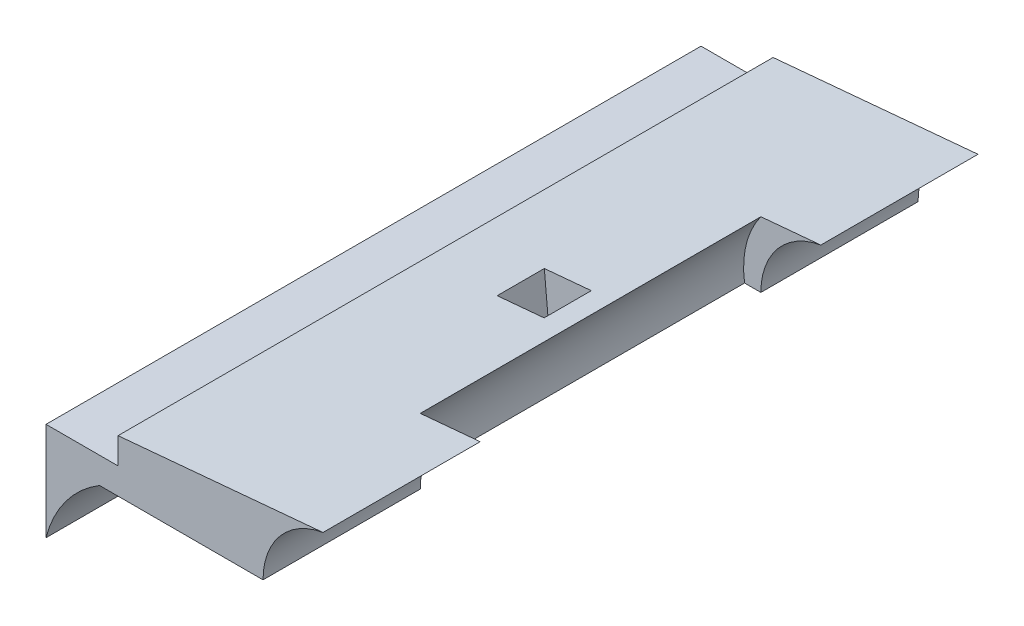
ISO-10303-21;
HEADER;
FILE_DESCRIPTION(('STEP AP214'),'2;1');
FILE_NAME('part.step','',(''),(''),'','','');
FILE_SCHEMA(('AUTOMOTIVE_DESIGN { 1 0 10303 214 1 1 1 1 }'));
ENDSEC;
DATA;
#1=APPLICATION_CONTEXT('core data for automotive mechanical design processes');
#2=APPLICATION_PROTOCOL_DEFINITION('international standard','automotive_design',2000,#1);
#3=PRODUCT_CONTEXT('',#1,'mechanical');
#4=PRODUCT('Part','Part','',(#3));
#5=PRODUCT_RELATED_PRODUCT_CATEGORY('part','',(#4));
#6=PRODUCT_DEFINITION_FORMATION('','',#4);
#7=PRODUCT_DEFINITION_CONTEXT('part definition',#1,'design');
#8=PRODUCT_DEFINITION('design','',#6,#7);
#9=PRODUCT_DEFINITION_SHAPE('','',#8);
#10=(LENGTH_UNIT() NAMED_UNIT(*) SI_UNIT(.MILLI.,.METRE.));
#11=(NAMED_UNIT(*) PLANE_ANGLE_UNIT() SI_UNIT($,.RADIAN.));
#12=(NAMED_UNIT(*) SI_UNIT($,.STERADIAN.) SOLID_ANGLE_UNIT());
#13=UNCERTAINTY_MEASURE_WITH_UNIT(LENGTH_MEASURE(1.E-05),#10,'distance_accuracy_value','');
#14=(GEOMETRIC_REPRESENTATION_CONTEXT(3) GLOBAL_UNCERTAINTY_ASSIGNED_CONTEXT((#13)) GLOBAL_UNIT_ASSIGNED_CONTEXT((#10,
#11,#12)) REPRESENTATION_CONTEXT('',''));
#15=CARTESIAN_POINT('',(0.,0.,0.));
#16=DIRECTION('',(0.,0.,1.));
#17=DIRECTION('',(1.,0.,0.));
#18=AXIS2_PLACEMENT_3D('',#15,#16,#17);
#19=CARTESIAN_POINT('',(0.,-4.,100.));
#20=DIRECTION('',(0.,1.,0.));
#21=DIRECTION('',(0.,0.,1.));
#22=AXIS2_PLACEMENT_3D('',#19,#20,#21);
#23=PLANE('',#22);
#24=DIRECTION('',(1.,0.,0.));
#25=VECTOR('',#24,1.);
#26=CARTESIAN_POINT('',(0.,-4.,52.75));
#27=LINE('',#26,#25);
#28=CARTESIAN_POINT('',(24.1543262491301,-4.,52.75));
#29=VERTEX_POINT('',#28);
#30=CARTESIAN_POINT('',(29.6770067577237,-4.,52.75));
#31=VERTEX_POINT('',#30);
#32=EDGE_CURVE('E310',#29,#31,#27,.T.);
#33=ORIENTED_EDGE('',*,*,#32,.T.);
#34=DIRECTION('',(0.,0.,-1.));
#35=VECTOR('',#34,1.);
#36=CARTESIAN_POINT('',(29.6770067577237,-4.,100.));
#37=LINE('',#36,#35);
#38=CARTESIAN_POINT('',(29.6770067577237,-4.,47.25));
#39=VERTEX_POINT('',#38);
#40=EDGE_CURVE('E46',#31,#39,#37,.T.);
#41=ORIENTED_EDGE('',*,*,#40,.T.);
#42=DIRECTION('',(-1.,0.,0.));
#43=VECTOR('',#42,1.);
#44=CARTESIAN_POINT('',(0.,-4.,47.25));
#45=LINE('',#44,#43);
#46=CARTESIAN_POINT('',(24.1543262491301,-4.,47.25));
#47=VERTEX_POINT('',#46);
#48=EDGE_CURVE('E304',#39,#47,#45,.T.);
#49=ORIENTED_EDGE('',*,*,#48,.T.);
#50=DIRECTION('',(0.,0.,1.));
#51=VECTOR('',#50,1.);
#52=CARTESIAN_POINT('',(24.1543262491301,-4.,100.));
#53=LINE('',#52,#51);
#54=EDGE_CURVE('E307',#47,#29,#53,.T.);
#55=ORIENTED_EDGE('',*,*,#54,.T.);
#56=EDGE_LOOP('',(#33,#41,#49,#55));
#57=FACE_BOUND('',#56,.T.);
#58=DIRECTION('',(0.,0.,1.));
#59=VECTOR('',#58,1.);
#60=CARTESIAN_POINT('',(8.16987101881421,-4.,-13.7020725608961));
#61=LINE('',#60,#59);
#62=CARTESIAN_POINT('',(8.16987101881421,-4.,0.));
#63=VERTEX_POINT('',#62);
#64=CARTESIAN_POINT('',(8.16987101881421,-4.,100.));
#65=VERTEX_POINT('',#64);
#66=EDGE_CURVE('E53',#63,#65,#61,.T.);
#67=ORIENTED_EDGE('',*,*,#66,.F.);
#68=DIRECTION('',(1.,0.,0.));
#69=VECTOR('',#68,1.);
#70=CARTESIAN_POINT('',(0.,-4.,0.));
#71=LINE('',#70,#69);
#72=CARTESIAN_POINT('',(33.1347405111228,-4.,0.));
#73=VERTEX_POINT('',#72);
#74=EDGE_CURVE('E57',#63,#73,#71,.T.);
#75=ORIENTED_EDGE('',*,*,#74,.T.);
#76=DIRECTION('',(0.,0.,-1.));
#77=VECTOR('',#76,1.);
#78=CARTESIAN_POINT('',(33.1347405111228,-4.,332.255464372097));
#79=LINE('',#78,#77);
#80=CARTESIAN_POINT('',(33.1347405111228,-4.,24.));
#81=VERTEX_POINT('',#80);
#82=EDGE_CURVE('E196',#81,#73,#79,.T.);
#83=ORIENTED_EDGE('',*,*,#82,.F.);
#84=DIRECTION('',(1.,0.,0.));
#85=VECTOR('',#84,1.);
#86=CARTESIAN_POINT('',(0.,-4.,24.));
#87=LINE('',#86,#85);
#88=CARTESIAN_POINT('',(30.6489700771813,-4.,24.));
#89=VERTEX_POINT('',#88);
#90=EDGE_CURVE('E269',#89,#81,#87,.T.);
#91=ORIENTED_EDGE('',*,*,#90,.F.);
#92=DIRECTION('',(0.,0.,-1.));
#93=VECTOR('',#92,1.);
#94=CARTESIAN_POINT('',(30.6489700771813,-4.,76.));
#95=LINE('',#94,#93);
#96=CARTESIAN_POINT('',(30.6489700771813,-4.,76.));
#97=VERTEX_POINT('',#96);
#98=EDGE_CURVE('E274',#97,#89,#95,.T.);
#99=ORIENTED_EDGE('',*,*,#98,.F.);
#100=DIRECTION('',(1.,0.,0.));
#101=VECTOR('',#100,1.);
#102=CARTESIAN_POINT('',(0.,-4.,76.));
#103=LINE('',#102,#101);
#104=CARTESIAN_POINT('',(33.1347405111228,-4.,76.));
#105=VERTEX_POINT('',#104);
#106=EDGE_CURVE('E271',#97,#105,#103,.T.);
#107=ORIENTED_EDGE('',*,*,#106,.T.);
#108=CARTESIAN_POINT('',(33.1347405111228,-4.,100.));
#109=VERTEX_POINT('',#108);
#110=EDGE_CURVE('E199',#109,#105,#79,.T.);
#111=ORIENTED_EDGE('',*,*,#110,.F.);
#112=DIRECTION('',(1.,0.,0.));
#113=VECTOR('',#112,1.);
#114=CARTESIAN_POINT('',(0.,-4.,100.));
#115=LINE('',#114,#113);
#116=EDGE_CURVE('E179',#65,#109,#115,.T.);
#117=ORIENTED_EDGE('',*,*,#116,.F.);
#118=EDGE_LOOP('',(#67,#75,#83,#91,#99,#107,#111,#117));
#119=FACE_BOUND('',#118,.T.);
#120=ADVANCED_FACE('F38',(#57,#119),#23,.F.);
#121=CARTESIAN_POINT('',(0.,0.,100.));
#122=DIRECTION('',(1.,0.,0.));
#123=DIRECTION('',(0.,1.,0.));
#124=AXIS2_PLACEMENT_3D('',#121,#122,#123);
#125=PLANE('',#124);
#126=DIRECTION('',(0.,-1.,0.));
#127=VECTOR('',#126,1.);
#128=CARTESIAN_POINT('',(0.,0.,0.));
#129=LINE('',#128,#127);
#130=CARTESIAN_POINT('',(0.,0.,0.));
#131=VERTEX_POINT('',#130);
#132=CARTESIAN_POINT('',(0.,-15.,0.));
#133=VERTEX_POINT('',#132);
#134=EDGE_CURVE('E185',#131,#133,#129,.T.);
#135=ORIENTED_EDGE('',*,*,#134,.T.);
#136=DIRECTION('',(0.,0.,1.));
#137=VECTOR('',#136,1.);
#138=CARTESIAN_POINT('',(0.,-15.,-13.7020725608961));
#139=LINE('',#138,#137);
#140=CARTESIAN_POINT('',(0.,-15.,100.));
#141=VERTEX_POINT('',#140);
#142=EDGE_CURVE('E183',#133,#141,#139,.T.);
#143=ORIENTED_EDGE('',*,*,#142,.T.);
#144=DIRECTION('',(0.,-1.,0.));
#145=VECTOR('',#144,1.);
#146=CARTESIAN_POINT('',(0.,0.,100.));
#147=LINE('',#146,#145);
#148=CARTESIAN_POINT('',(0.,0.,100.));
#149=VERTEX_POINT('',#148);
#150=EDGE_CURVE('E168',#149,#141,#147,.T.);
#151=ORIENTED_EDGE('',*,*,#150,.F.);
#152=DIRECTION('',(0.,0.,-1.));
#153=VECTOR('',#152,1.);
#154=CARTESIAN_POINT('',(0.,0.,100.));
#155=LINE('',#154,#153);
#156=EDGE_CURVE('E282',#149,#131,#155,.T.);
#157=ORIENTED_EDGE('',*,*,#156,.T.);
#158=EDGE_LOOP('',(#135,#143,#151,#157));
#159=FACE_BOUND('',#158,.T.);
#160=ADVANCED_FACE('F40',(#159),#125,.F.);
#161=CARTESIAN_POINT('',(11.,4.,100.));
#162=DIRECTION('',(0.0905357460425185,-0.995893206467704,0.));
#163=DIRECTION('',(0.995893206467704,0.0905357460425185,0.));
#164=AXIS2_PLACEMENT_3D('',#161,#162,#163);
#165=PLANE('',#164);
#166=DIRECTION('',(-0.995893206467704,-0.0905357460425186,0.));
#167=VECTOR('',#166,1.);
#168=CARTESIAN_POINT('',(22.4786832019183,5.04351665471985,46.4));
#169=LINE('',#168,#167);
#170=CARTESIAN_POINT('',(29.6491142884858,5.69537402622598,46.4));
#171=VERTEX_POINT('',#170);
#172=CARTESIAN_POINT('',(22.4786832019183,5.04351665471985,46.4));
#173=VERTEX_POINT('',#172);
#174=EDGE_CURVE('E247',#171,#173,#169,.T.);
#175=ORIENTED_EDGE('',*,*,#174,.F.);
#176=DIRECTION('',(0.,0.,-1.));
#177=VECTOR('',#176,1.);
#178=CARTESIAN_POINT('',(29.6491142884858,5.69537402622598,46.4));
#179=LINE('',#178,#177);
#180=CARTESIAN_POINT('',(29.6491142884858,5.69537402622598,53.6));
#181=VERTEX_POINT('',#180);
#182=EDGE_CURVE('E225',#181,#171,#179,.T.);
#183=ORIENTED_EDGE('',*,*,#182,.F.);
#184=DIRECTION('',(0.995893206467704,0.0905357460425186,0.));
#185=VECTOR('',#184,1.);
#186=CARTESIAN_POINT('',(22.4786832019183,5.04351665471985,53.6));
#187=LINE('',#186,#185);
#188=CARTESIAN_POINT('',(22.4786832019183,5.04351665471985,53.6));
#189=VERTEX_POINT('',#188);
#190=EDGE_CURVE('E236',#189,#181,#187,.T.);
#191=ORIENTED_EDGE('',*,*,#190,.F.);
#192=DIRECTION('',(0.,0.,1.));
#193=VECTOR('',#192,1.);
#194=CARTESIAN_POINT('',(22.4786832019183,5.04351665471985,46.4));
#195=LINE('',#194,#193);
#196=EDGE_CURVE('E250',#173,#189,#195,.T.);
#197=ORIENTED_EDGE('',*,*,#196,.F.);
#198=EDGE_LOOP('',(#175,#183,#191,#197));
#199=FACE_BOUND('',#198,.T.);
#200=DIRECTION('',(-0.995893206467704,-0.0905357460425185,0.));
#201=VECTOR('',#200,1.);
#202=CARTESIAN_POINT('',(11.,4.,100.));
#203=LINE('',#202,#201);
#204=CARTESIAN_POINT('',(42.2853228303339,6.84412025730308,100.));
#205=VERTEX_POINT('',#204);
#206=CARTESIAN_POINT('',(11.,4.,100.));
#207=VERTEX_POINT('',#206);
#208=EDGE_CURVE('E277',#205,#207,#203,.T.);
#209=ORIENTED_EDGE('',*,*,#208,.F.);
#210=DIRECTION('',(0.,0.,-1.));
#211=VECTOR('',#210,1.);
#212=CARTESIAN_POINT('',(42.2853228303339,6.84412025730308,332.255464372097));
#213=LINE('',#212,#211);
#214=CARTESIAN_POINT('',(42.2853228303339,6.84412025730308,76.));
#215=VERTEX_POINT('',#214);
#216=EDGE_CURVE('E203',#205,#215,#213,.T.);
#217=ORIENTED_EDGE('',*,*,#216,.T.);
#218=DIRECTION('',(-0.995893206467704,-0.0905357460425185,0.));
#219=VECTOR('',#218,1.);
#220=CARTESIAN_POINT('',(11.,4.,76.));
#221=LINE('',#220,#219);
#222=CARTESIAN_POINT('',(33.1347405111228,6.0122491373748,76.));
#223=VERTEX_POINT('',#222);
#224=EDGE_CURVE('E302',#215,#223,#221,.T.);
#225=ORIENTED_EDGE('',*,*,#224,.T.);
#226=DIRECTION('',(0.,0.,-1.));
#227=VECTOR('',#226,1.);
#228=CARTESIAN_POINT('',(33.1347405111228,6.0122491373748,76.));
#229=LINE('',#228,#227);
#230=CARTESIAN_POINT('',(33.1347405111228,6.0122491373748,24.));
#231=VERTEX_POINT('',#230);
#232=EDGE_CURVE('E299',#231,#223,#229,.F.);
#233=ORIENTED_EDGE('',*,*,#232,.F.);
#234=DIRECTION('',(-0.995893206467704,-0.0905357460425185,0.));
#235=VECTOR('',#234,1.);
#236=CARTESIAN_POINT('',(11.,4.,24.));
#237=LINE('',#236,#235);
#238=CARTESIAN_POINT('',(42.2853228303339,6.84412025730308,24.));
#239=VERTEX_POINT('',#238);
#240=EDGE_CURVE('E297',#239,#231,#237,.T.);
#241=ORIENTED_EDGE('',*,*,#240,.F.);
#242=CARTESIAN_POINT('',(42.2853228303339,6.84412025730308,0.));
#243=VERTEX_POINT('',#242);
#244=EDGE_CURVE('E200',#239,#243,#213,.T.);
#245=ORIENTED_EDGE('',*,*,#244,.T.);
#246=DIRECTION('',(-0.995893206467704,-0.0905357460425185,0.));
#247=VECTOR('',#246,1.);
#248=CARTESIAN_POINT('',(11.,4.,0.));
#249=LINE('',#248,#247);
#250=CARTESIAN_POINT('',(11.,4.,0.));
#251=VERTEX_POINT('',#250);
#252=EDGE_CURVE('E285',#243,#251,#249,.T.);
#253=ORIENTED_EDGE('',*,*,#252,.T.);
#254=DIRECTION('',(0.,0.,-1.));
#255=VECTOR('',#254,1.);
#256=CARTESIAN_POINT('',(11.,4.,100.));
#257=LINE('',#256,#255);
#258=EDGE_CURVE('E294',#207,#251,#257,.T.);
#259=ORIENTED_EDGE('',*,*,#258,.F.);
#260=EDGE_LOOP('',(#209,#217,#225,#233,#241,#245,#253,#259));
#261=FACE_BOUND('',#260,.T.);
#262=ADVANCED_FACE('F346',(#199,#261),#165,.F.);
#263=CARTESIAN_POINT('',(11.,0.,100.));
#264=DIRECTION('',(1.,0.,0.));
#265=DIRECTION('',(0.,0.,-1.));
#266=AXIS2_PLACEMENT_3D('',#263,#264,#265);
#267=PLANE('',#266);
#268=DIRECTION('',(0.,-1.,0.));
#269=VECTOR('',#268,1.);
#270=CARTESIAN_POINT('',(11.,0.,0.));
#271=LINE('',#270,#269);
#272=CARTESIAN_POINT('',(11.,0.,0.));
#273=VERTEX_POINT('',#272);
#274=EDGE_CURVE('E287',#251,#273,#271,.T.);
#275=ORIENTED_EDGE('',*,*,#274,.T.);
#276=DIRECTION('',(0.,0.,-1.));
#277=VECTOR('',#276,1.);
#278=CARTESIAN_POINT('',(11.,0.,100.));
#279=LINE('',#278,#277);
#280=CARTESIAN_POINT('',(11.,0.,100.));
#281=VERTEX_POINT('',#280);
#282=EDGE_CURVE('E291',#281,#273,#279,.T.);
#283=ORIENTED_EDGE('',*,*,#282,.F.);
#284=DIRECTION('',(0.,-1.,0.));
#285=VECTOR('',#284,1.);
#286=CARTESIAN_POINT('',(11.,0.,100.));
#287=LINE('',#286,#285);
#288=EDGE_CURVE('E279',#207,#281,#287,.T.);
#289=ORIENTED_EDGE('',*,*,#288,.F.);
#290=ORIENTED_EDGE('',*,*,#258,.T.);
#291=EDGE_LOOP('',(#275,#283,#289,#290));
#292=FACE_BOUND('',#291,.T.);
#293=ADVANCED_FACE('F350',(#292),#267,.F.);
#294=CARTESIAN_POINT('',(0.,0.,100.));
#295=DIRECTION('',(0.,-1.,0.));
#296=DIRECTION('',(0.,0.,-1.));
#297=AXIS2_PLACEMENT_3D('',#294,#295,#296);
#298=PLANE('',#297);
#299=DIRECTION('',(-1.,0.,0.));
#300=VECTOR('',#299,1.);
#301=CARTESIAN_POINT('',(0.,0.,0.));
#302=LINE('',#301,#300);
#303=EDGE_CURVE('E180',#273,#131,#302,.T.);
#304=ORIENTED_EDGE('',*,*,#303,.T.);
#305=ORIENTED_EDGE('',*,*,#156,.F.);
#306=DIRECTION('',(-1.,0.,0.));
#307=VECTOR('',#306,1.);
#308=CARTESIAN_POINT('',(0.,0.,100.));
#309=LINE('',#308,#307);
#310=EDGE_CURVE('E175',#281,#149,#309,.T.);
#311=ORIENTED_EDGE('',*,*,#310,.F.);
#312=ORIENTED_EDGE('',*,*,#282,.T.);
#313=EDGE_LOOP('',(#304,#305,#311,#312));
#314=FACE_BOUND('',#313,.T.);
#315=ADVANCED_FACE('F354',(#314),#298,.F.);
#316=CARTESIAN_POINT('',(44.,-2.,100.));
#317=DIRECTION('',(0.,0.,1.));
#318=DIRECTION('',(1.,0.,0.));
#319=AXIS2_PLACEMENT_3D('',#316,#317,#318);
#320=PLANE('',#319);
#321=CARTESIAN_POINT('',(44.135575972317,-4.,100.));
#322=DIRECTION('',(0.,0.,1.));
#323=DIRECTION('',(1.,0.,0.));
#324=AXIS2_PLACEMENT_3D('',#321,#322,#323);
#325=CIRCLE('',#324,11.0008354611943);
#326=EDGE_CURVE('E208',#205,#109,#325,.T.);
#327=ORIENTED_EDGE('',*,*,#326,.F.);
#328=ORIENTED_EDGE('',*,*,#208,.T.);
#329=ORIENTED_EDGE('',*,*,#288,.T.);
#330=ORIENTED_EDGE('',*,*,#310,.T.);
#331=ORIENTED_EDGE('',*,*,#150,.T.);
#332=CARTESIAN_POINT('',(17.5015587386364,-19.4647346628028,100.));
#333=DIRECTION('',(0.,0.,-1.));
#334=DIRECTION('',(-1.,0.,0.));
#335=AXIS2_PLACEMENT_3D('',#332,#333,#334);
#336=CIRCLE('',#335,18.0620711406852);
#337=EDGE_CURVE('E173',#141,#65,#336,.T.);
#338=ORIENTED_EDGE('',*,*,#337,.T.);
#339=ORIENTED_EDGE('',*,*,#116,.T.);
#340=EDGE_LOOP('',(#327,#328,#329,#330,#331,#338,#339));
#341=FACE_BOUND('',#340,.T.);
#342=ADVANCED_FACE('F171',(#341),#320,.T.);
#343=CARTESIAN_POINT('',(44.,-2.,0.));
#344=DIRECTION('',(0.,0.,1.));
#345=DIRECTION('',(1.,0.,0.));
#346=AXIS2_PLACEMENT_3D('',#343,#344,#345);
#347=PLANE('',#346);
#348=ORIENTED_EDGE('',*,*,#252,.F.);
#349=CARTESIAN_POINT('',(44.135575972317,-4.,0.));
#350=DIRECTION('',(0.,0.,1.));
#351=DIRECTION('',(1.,0.,0.));
#352=AXIS2_PLACEMENT_3D('',#349,#350,#351);
#353=CIRCLE('',#352,11.0008354611943);
#354=EDGE_CURVE('E202',#243,#73,#353,.T.);
#355=ORIENTED_EDGE('',*,*,#354,.T.);
#356=ORIENTED_EDGE('',*,*,#74,.F.);
#357=CARTESIAN_POINT('',(17.5015587386364,-19.4647346628028,0.));
#358=DIRECTION('',(0.,0.,1.));
#359=DIRECTION('',(1.,0.,0.));
#360=AXIS2_PLACEMENT_3D('',#357,#358,#359);
#361=CIRCLE('',#360,18.0620711406852);
#362=EDGE_CURVE('E194',#63,#133,#361,.T.);
#363=ORIENTED_EDGE('',*,*,#362,.T.);
#364=ORIENTED_EDGE('',*,*,#134,.F.);
#365=ORIENTED_EDGE('',*,*,#303,.F.);
#366=ORIENTED_EDGE('',*,*,#274,.F.);
#367=EDGE_LOOP('',(#348,#355,#356,#363,#364,#365,#366));
#368=FACE_BOUND('',#367,.T.);
#369=ADVANCED_FACE('F359',(#368),#347,.F.);
#370=CARTESIAN_POINT('',(44.,-2.,76.));
#371=DIRECTION('',(0.,0.,-1.));
#372=DIRECTION('',(-1.,0.,0.));
#373=AXIS2_PLACEMENT_3D('',#370,#371,#372);
#374=CYLINDRICAL_SURFACE('',#373,13.5);
#375=ORIENTED_EDGE('',*,*,#98,.T.);
#376=CARTESIAN_POINT('',(44.,-2.,24.));
#377=DIRECTION('',(0.,0.,1.));
#378=DIRECTION('',(1.,0.,0.));
#379=AXIS2_PLACEMENT_3D('',#376,#377,#378);
#380=CIRCLE('',#379,13.5);
#381=EDGE_CURVE('E257',#231,#89,#380,.T.);
#382=ORIENTED_EDGE('',*,*,#381,.F.);
#383=ORIENTED_EDGE('',*,*,#232,.T.);
#384=CARTESIAN_POINT('',(44.,-2.,76.));
#385=DIRECTION('',(0.,0.,1.));
#386=DIRECTION('',(1.,0.,0.));
#387=AXIS2_PLACEMENT_3D('',#384,#385,#386);
#388=CIRCLE('',#387,13.5);
#389=EDGE_CURVE('E266',#223,#97,#388,.T.);
#390=ORIENTED_EDGE('',*,*,#389,.T.);
#391=EDGE_LOOP('',(#375,#382,#383,#390));
#392=FACE_BOUND('',#391,.T.);
#393=ADVANCED_FACE('F362',(#392),#374,.F.);
#394=CARTESIAN_POINT('',(44.,-2.,76.));
#395=DIRECTION('',(0.,0.,1.));
#396=DIRECTION('',(1.,0.,0.));
#397=AXIS2_PLACEMENT_3D('',#394,#395,#396);
#398=PLANE('',#397);
#399=ORIENTED_EDGE('',*,*,#224,.F.);
#400=CARTESIAN_POINT('',(44.135575972317,-4.,76.));
#401=DIRECTION('',(0.,0.,1.));
#402=DIRECTION('',(1.,0.,0.));
#403=AXIS2_PLACEMENT_3D('',#400,#401,#402);
#404=CIRCLE('',#403,11.0008354611943);
#405=EDGE_CURVE('E205',#215,#105,#404,.T.);
#406=ORIENTED_EDGE('',*,*,#405,.T.);
#407=ORIENTED_EDGE('',*,*,#106,.F.);
#408=ORIENTED_EDGE('',*,*,#389,.F.);
#409=EDGE_LOOP('',(#399,#406,#407,#408));
#410=FACE_BOUND('',#409,.T.);
#411=ADVANCED_FACE('F368',(#410),#398,.F.);
#412=CARTESIAN_POINT('',(44.,-2.,24.));
#413=DIRECTION('',(0.,0.,1.));
#414=DIRECTION('',(1.,0.,0.));
#415=AXIS2_PLACEMENT_3D('',#412,#413,#414);
#416=PLANE('',#415);
#417=CARTESIAN_POINT('',(44.135575972317,-4.,24.));
#418=DIRECTION('',(0.,0.,1.));
#419=DIRECTION('',(1.,0.,0.));
#420=AXIS2_PLACEMENT_3D('',#417,#418,#419);
#421=CIRCLE('',#420,11.0008354611943);
#422=EDGE_CURVE('E11',#239,#81,#421,.T.);
#423=ORIENTED_EDGE('',*,*,#422,.F.);
#424=ORIENTED_EDGE('',*,*,#240,.T.);
#425=ORIENTED_EDGE('',*,*,#381,.T.);
#426=ORIENTED_EDGE('',*,*,#90,.T.);
#427=EDGE_LOOP('',(#423,#424,#425,#426));
#428=FACE_BOUND('',#427,.T.);
#429=ADVANCED_FACE('F372',(#428),#416,.T.);
#430=CARTESIAN_POINT('',(30.1923287647409,-0.279985212580241,46.4));
#431=DIRECTION('',(0.995893206467704,0.0905357460425185,0.));
#432=DIRECTION('',(-0.0905357460425185,0.995893206467704,0.));
#433=AXIS2_PLACEMENT_3D('',#430,#431,#432);
#434=PLANE('',#433);
#435=ORIENTED_EDGE('',*,*,#182,.T.);
#436=DIRECTION('',(-0.0905357460425185,0.995893206467704,0.));
#437=VECTOR('',#436,1.);
#438=CARTESIAN_POINT('',(30.1923287647409,-0.279985212580241,46.4));
#439=LINE('',#438,#437);
#440=CARTESIAN_POINT('',(30.1923287647409,-0.279985212580241,46.4));
#441=VERTEX_POINT('',#440);
#442=EDGE_CURVE('E245',#441,#171,#439,.T.);
#443=ORIENTED_EDGE('',*,*,#442,.F.);
#444=DIRECTION('',(0.,0.,-1.));
#445=VECTOR('',#444,1.);
#446=CARTESIAN_POINT('',(30.1923287647409,-0.279985212580241,46.4));
#447=LINE('',#446,#445);
#448=CARTESIAN_POINT('',(30.1923287647409,-0.279985212580241,53.6));
#449=VERTEX_POINT('',#448);
#450=EDGE_CURVE('E232',#449,#441,#447,.T.);
#451=ORIENTED_EDGE('',*,*,#450,.F.);
#452=DIRECTION('',(-0.0905357460425185,0.995893206467704,0.));
#453=VECTOR('',#452,1.);
#454=CARTESIAN_POINT('',(30.1923287647409,-0.279985212580241,53.6));
#455=LINE('',#454,#453);
#456=EDGE_CURVE('E255',#449,#181,#455,.T.);
#457=ORIENTED_EDGE('',*,*,#456,.T.);
#458=EDGE_LOOP('',(#435,#443,#451,#457));
#459=FACE_BOUND('',#458,.T.);
#460=ADVANCED_FACE('F376',(#459),#434,.F.);
#461=CARTESIAN_POINT('',(23.0218976781734,-0.931842584086374,53.6));
#462=DIRECTION('',(0.,0.,1.));
#463=DIRECTION('',(1.,0.,0.));
#464=AXIS2_PLACEMENT_3D('',#461,#462,#463);
#465=PLANE('',#464);
#466=ORIENTED_EDGE('',*,*,#190,.T.);
#467=ORIENTED_EDGE('',*,*,#456,.F.);
#468=DIRECTION('',(0.995893206467704,0.0905357460425186,0.));
#469=VECTOR('',#468,1.);
#470=CARTESIAN_POINT('',(23.0218976781734,-0.931842584086374,53.6));
#471=LINE('',#470,#469);
#472=CARTESIAN_POINT('',(23.0218976781734,-0.931842584086374,53.6));
#473=VERTEX_POINT('',#472);
#474=EDGE_CURVE('E242',#473,#449,#471,.T.);
#475=ORIENTED_EDGE('',*,*,#474,.F.);
#476=DIRECTION('',(-0.0905357460425185,0.995893206467704,0.));
#477=VECTOR('',#476,1.);
#478=CARTESIAN_POINT('',(23.0218976781734,-0.931842584086374,53.6));
#479=LINE('',#478,#477);
#480=EDGE_CURVE('E258',#473,#189,#479,.T.);
#481=ORIENTED_EDGE('',*,*,#480,.T.);
#482=EDGE_LOOP('',(#466,#467,#475,#481));
#483=FACE_BOUND('',#482,.T.);
#484=ADVANCED_FACE('F380',(#483),#465,.F.);
#485=CARTESIAN_POINT('',(23.0218976781734,-0.931842584086375,46.4));
#486=DIRECTION('',(-0.995893206467704,-0.0905357460425185,0.));
#487=DIRECTION('',(0.0905357460425185,-0.995893206467704,0.));
#488=AXIS2_PLACEMENT_3D('',#485,#486,#487);
#489=PLANE('',#488);
#490=ORIENTED_EDGE('',*,*,#196,.T.);
#491=ORIENTED_EDGE('',*,*,#480,.F.);
#492=DIRECTION('',(0.,0.,1.));
#493=VECTOR('',#492,1.);
#494=CARTESIAN_POINT('',(23.0218976781734,-0.931842584086375,46.4));
#495=LINE('',#494,#493);
#496=CARTESIAN_POINT('',(23.0218976781734,-0.931842584086375,46.4));
#497=VERTEX_POINT('',#496);
#498=EDGE_CURVE('E239',#497,#473,#495,.T.);
#499=ORIENTED_EDGE('',*,*,#498,.F.);
#500=DIRECTION('',(-0.0905357460425185,0.995893206467704,0.));
#501=VECTOR('',#500,1.);
#502=CARTESIAN_POINT('',(23.0218976781734,-0.931842584086375,46.4));
#503=LINE('',#502,#501);
#504=EDGE_CURVE('E260',#497,#173,#503,.T.);
#505=ORIENTED_EDGE('',*,*,#504,.T.);
#506=EDGE_LOOP('',(#490,#491,#499,#505));
#507=FACE_BOUND('',#506,.T.);
#508=ADVANCED_FACE('F385',(#507),#489,.F.);
#509=CARTESIAN_POINT('',(23.0218976781734,-0.931842584086375,46.4));
#510=DIRECTION('',(0.,0.,-1.));
#511=DIRECTION('',(-1.,0.,0.));
#512=AXIS2_PLACEMENT_3D('',#509,#510,#511);
#513=PLANE('',#512);
#514=ORIENTED_EDGE('',*,*,#174,.T.);
#515=ORIENTED_EDGE('',*,*,#504,.F.);
#516=DIRECTION('',(-0.995893206467704,-0.0905357460425186,0.));
#517=VECTOR('',#516,1.);
#518=CARTESIAN_POINT('',(23.0218976781734,-0.931842584086375,46.4));
#519=LINE('',#518,#517);
#520=EDGE_CURVE('E235',#441,#497,#519,.T.);
#521=ORIENTED_EDGE('',*,*,#520,.F.);
#522=ORIENTED_EDGE('',*,*,#442,.T.);
#523=EDGE_LOOP('',(#514,#515,#521,#522));
#524=FACE_BOUND('',#523,.T.);
#525=ADVANCED_FACE('F382',(#524),#513,.F.);
#526=CARTESIAN_POINT('',(0.272722672976423,-2.99994940274065,0.));
#527=DIRECTION('',(-0.0905357460425186,0.995893206467704,0.));
#528=DIRECTION('',(-0.995893206467704,-0.0905357460425186,0.));
#529=AXIS2_PLACEMENT_3D('',#526,#527,#528);
#530=PLANE('',#529);
#531=DIRECTION('',(0.,0.,-1.));
#532=VECTOR('',#531,1.);
#533=CARTESIAN_POINT('',(29.3458195392434,-0.356940596716381,52.75));
#534=LINE('',#533,#532);
#535=CARTESIAN_POINT('',(29.3458195392434,-0.356940596716381,52.75));
#536=VERTEX_POINT('',#535);
#537=CARTESIAN_POINT('',(29.3458195392434,-0.356940596716381,47.25));
#538=VERTEX_POINT('',#537);
#539=EDGE_CURVE('E211',#536,#538,#534,.T.);
#540=ORIENTED_EDGE('',*,*,#539,.F.);
#541=DIRECTION('',(0.995893206467704,0.0905357460425185,0.));
#542=VECTOR('',#541,1.);
#543=CARTESIAN_POINT('',(23.868406903671,-0.854887199950233,52.75));
#544=LINE('',#543,#542);
#545=CARTESIAN_POINT('',(23.868406903671,-0.854887199950233,52.75));
#546=VERTEX_POINT('',#545);
#547=EDGE_CURVE('E219',#546,#536,#544,.T.);
#548=ORIENTED_EDGE('',*,*,#547,.F.);
#549=DIRECTION('',(0.,0.,1.));
#550=VECTOR('',#549,1.);
#551=CARTESIAN_POINT('',(23.868406903671,-0.854887199950233,52.75));
#552=LINE('',#551,#550);
#553=CARTESIAN_POINT('',(23.868406903671,-0.854887199950233,47.25));
#554=VERTEX_POINT('',#553);
#555=EDGE_CURVE('E217',#554,#546,#552,.T.);
#556=ORIENTED_EDGE('',*,*,#555,.F.);
#557=DIRECTION('',(-0.995893206467704,-0.0905357460425185,0.));
#558=VECTOR('',#557,1.);
#559=CARTESIAN_POINT('',(23.868406903671,-0.854887199950233,47.25));
#560=LINE('',#559,#558);
#561=EDGE_CURVE('E214',#538,#554,#560,.T.);
#562=ORIENTED_EDGE('',*,*,#561,.F.);
#563=EDGE_LOOP('',(#540,#548,#556,#562));
#564=FACE_BOUND('',#563,.T.);
#565=ORIENTED_EDGE('',*,*,#450,.T.);
#566=ORIENTED_EDGE('',*,*,#520,.T.);
#567=ORIENTED_EDGE('',*,*,#498,.T.);
#568=ORIENTED_EDGE('',*,*,#474,.T.);
#569=EDGE_LOOP('',(#565,#566,#567,#568));
#570=FACE_BOUND('',#569,.T.);
#571=ADVANCED_FACE('F326',(#564,#570),#530,.T.);
#572=CARTESIAN_POINT('',(29.8890340154985,-6.33229983552261,52.75));
#573=DIRECTION('',(0.995893206467704,0.0905357460425185,0.));
#574=DIRECTION('',(-0.0905357460425185,0.995893206467704,0.));
#575=AXIS2_PLACEMENT_3D('',#572,#573,#574);
#576=PLANE('',#575);
#577=DIRECTION('',(-0.0905357460425185,0.995893206467704,0.));
#578=VECTOR('',#577,1.);
#579=CARTESIAN_POINT('',(29.8890340154985,-6.33229983552261,52.75));
#580=LINE('',#579,#578);
#581=EDGE_CURVE('E223',#31,#536,#580,.T.);
#582=ORIENTED_EDGE('',*,*,#581,.T.);
#583=ORIENTED_EDGE('',*,*,#539,.T.);
#584=DIRECTION('',(-0.0905357460425185,0.995893206467704,0.));
#585=VECTOR('',#584,1.);
#586=CARTESIAN_POINT('',(29.8890340154985,-6.33229983552261,47.25));
#587=LINE('',#586,#585);
#588=EDGE_CURVE('E222',#39,#538,#587,.T.);
#589=ORIENTED_EDGE('',*,*,#588,.F.);
#590=ORIENTED_EDGE('',*,*,#40,.F.);
#591=EDGE_LOOP('',(#582,#583,#589,#590));
#592=FACE_BOUND('',#591,.T.);
#593=ADVANCED_FACE('F317',(#592),#576,.F.);
#594=CARTESIAN_POINT('',(24.4116213799261,-6.83024643875646,52.75));
#595=DIRECTION('',(0.,0.,1.));
#596=DIRECTION('',(1.,0.,0.));
#597=AXIS2_PLACEMENT_3D('',#594,#595,#596);
#598=PLANE('',#597);
#599=DIRECTION('',(-0.0905357460425185,0.995893206467704,0.));
#600=VECTOR('',#599,1.);
#601=CARTESIAN_POINT('',(24.4116213799261,-6.83024643875646,52.75));
#602=LINE('',#601,#600);
#603=EDGE_CURVE('E226',#29,#546,#602,.T.);
#604=ORIENTED_EDGE('',*,*,#603,.T.);
#605=ORIENTED_EDGE('',*,*,#547,.T.);
#606=ORIENTED_EDGE('',*,*,#581,.F.);
#607=ORIENTED_EDGE('',*,*,#32,.F.);
#608=EDGE_LOOP('',(#604,#605,#606,#607));
#609=FACE_BOUND('',#608,.T.);
#610=ADVANCED_FACE('F319',(#609),#598,.F.);
#611=CARTESIAN_POINT('',(24.4116213799261,-6.83024643875646,52.75));
#612=DIRECTION('',(-0.995893206467704,-0.0905357460425185,0.));
#613=DIRECTION('',(0.0905357460425185,-0.995893206467704,0.));
#614=AXIS2_PLACEMENT_3D('',#611,#612,#613);
#615=PLANE('',#614);
#616=DIRECTION('',(-0.0905357460425185,0.995893206467704,0.));
#617=VECTOR('',#616,1.);
#618=CARTESIAN_POINT('',(24.4116213799261,-6.83024643875646,47.25));
#619=LINE('',#618,#617);
#620=EDGE_CURVE('E229',#47,#554,#619,.T.);
#621=ORIENTED_EDGE('',*,*,#620,.T.);
#622=ORIENTED_EDGE('',*,*,#555,.T.);
#623=ORIENTED_EDGE('',*,*,#603,.F.);
#624=ORIENTED_EDGE('',*,*,#54,.F.);
#625=EDGE_LOOP('',(#621,#622,#623,#624));
#626=FACE_BOUND('',#625,.T.);
#627=ADVANCED_FACE('F332',(#626),#615,.F.);
#628=CARTESIAN_POINT('',(24.4116213799261,-6.83024643875646,47.25));
#629=DIRECTION('',(0.,0.,-1.));
#630=DIRECTION('',(-1.,0.,0.));
#631=AXIS2_PLACEMENT_3D('',#628,#629,#630);
#632=PLANE('',#631);
#633=ORIENTED_EDGE('',*,*,#588,.T.);
#634=ORIENTED_EDGE('',*,*,#561,.T.);
#635=ORIENTED_EDGE('',*,*,#620,.F.);
#636=ORIENTED_EDGE('',*,*,#48,.F.);
#637=EDGE_LOOP('',(#633,#634,#635,#636));
#638=FACE_BOUND('',#637,.T.);
#639=ADVANCED_FACE('F329',(#638),#632,.F.);
#640=CARTESIAN_POINT('',(44.135575972317,-4.,332.255464372097));
#641=DIRECTION('',(0.,0.,-1.));
#642=DIRECTION('',(-1.,0.,0.));
#643=AXIS2_PLACEMENT_3D('',#640,#641,#642);
#644=CYLINDRICAL_SURFACE('',#643,11.0008354611943);
#645=ORIENTED_EDGE('',*,*,#354,.F.);
#646=ORIENTED_EDGE('',*,*,#244,.F.);
#647=ORIENTED_EDGE('',*,*,#422,.T.);
#648=ORIENTED_EDGE('',*,*,#82,.T.);
#649=EDGE_LOOP('',(#645,#646,#647,#648));
#650=FACE_BOUND('',#649,.T.);
#651=ADVANCED_FACE('F339',(#650),#644,.F.);
#652=ORIENTED_EDGE('',*,*,#216,.F.);
#653=ORIENTED_EDGE('',*,*,#326,.T.);
#654=ORIENTED_EDGE('',*,*,#110,.T.);
#655=ORIENTED_EDGE('',*,*,#405,.F.);
#656=EDGE_LOOP('',(#652,#653,#654,#655));
#657=FACE_BOUND('',#656,.T.);
#658=ADVANCED_FACE('F445',(#657),#644,.F.);
#659=CARTESIAN_POINT('',(17.5015587386364,-19.4647346628028,-13.7020725608961));
#660=DIRECTION('',(0.,0.,1.));
#661=DIRECTION('',(1.,0.,0.));
#662=AXIS2_PLACEMENT_3D('',#659,#660,#661);
#663=CYLINDRICAL_SURFACE('',#662,18.0620711406852);
#664=ORIENTED_EDGE('',*,*,#362,.F.);
#665=ORIENTED_EDGE('',*,*,#66,.T.);
#666=ORIENTED_EDGE('',*,*,#337,.F.);
#667=ORIENTED_EDGE('',*,*,#142,.F.);
#668=EDGE_LOOP('',(#664,#665,#666,#667));
#669=FACE_BOUND('',#668,.T.);
#670=ADVANCED_FACE('F190',(#669),#663,.F.);
#671=CLOSED_SHELL('',(#120,#160,#262,#293,#315,#342,#369,#393,#411,#429,#460,#484,#508,#525,
#571,#593,#610,#627,#639,#651,#658,#670));
#672=MANIFOLD_SOLID_BREP('B2',#671);
#673=ADVANCED_BREP_SHAPE_REPRESENTATION('',(#18,#672),#14);
#674=SHAPE_DEFINITION_REPRESENTATION(#9,#673);
ENDSEC;
END-ISO-10303-21;
